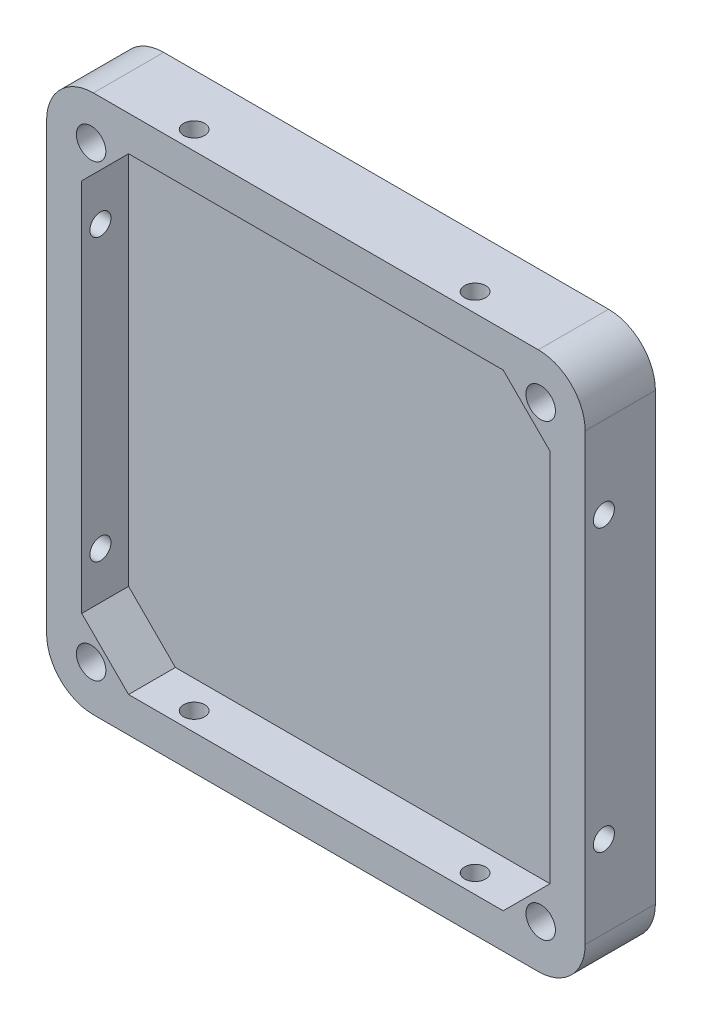
ISO-10303-21;
HEADER;
FILE_DESCRIPTION(('STEP AP214'),'2;1');
FILE_NAME('part.step','',(''),(''),'','','');
FILE_SCHEMA(('AUTOMOTIVE_DESIGN { 1 0 10303 214 1 1 1 1 }'));
ENDSEC;
DATA;
#1=APPLICATION_CONTEXT('core data for automotive mechanical design processes');
#2=APPLICATION_PROTOCOL_DEFINITION('international standard','automotive_design',2000,#1);
#3=PRODUCT_CONTEXT('',#1,'mechanical');
#4=PRODUCT('Part','Part','',(#3));
#5=PRODUCT_RELATED_PRODUCT_CATEGORY('part','',(#4));
#6=PRODUCT_DEFINITION_FORMATION('','',#4);
#7=PRODUCT_DEFINITION_CONTEXT('part definition',#1,'design');
#8=PRODUCT_DEFINITION('design','',#6,#7);
#9=PRODUCT_DEFINITION_SHAPE('','',#8);
#10=(LENGTH_UNIT() NAMED_UNIT(*) SI_UNIT(.MILLI.,.METRE.));
#11=(NAMED_UNIT(*) PLANE_ANGLE_UNIT() SI_UNIT($,.RADIAN.));
#12=(NAMED_UNIT(*) SI_UNIT($,.STERADIAN.) SOLID_ANGLE_UNIT());
#13=UNCERTAINTY_MEASURE_WITH_UNIT(LENGTH_MEASURE(1.E-05),#10,'distance_accuracy_value','');
#14=(GEOMETRIC_REPRESENTATION_CONTEXT(3) GLOBAL_UNCERTAINTY_ASSIGNED_CONTEXT((#13)) GLOBAL_UNIT_ASSIGNED_CONTEXT((#10,
#11,#12)) REPRESENTATION_CONTEXT('',''));
#15=CARTESIAN_POINT('',(0.,0.,0.));
#16=DIRECTION('',(0.,0.,1.));
#17=DIRECTION('',(1.,0.,0.));
#18=AXIS2_PLACEMENT_3D('',#15,#16,#17);
#19=CARTESIAN_POINT('',(-57.5,-57.5,7.5));
#20=DIRECTION('',(1.,0.,0.));
#21=DIRECTION('',(0.,0.,-1.));
#22=AXIS2_PLACEMENT_3D('',#19,#20,#21);
#23=PLANE('',#22);
#24=CARTESIAN_POINT('',(-57.5,-30.,3.5));
#25=DIRECTION('',(1.,0.,0.));
#26=DIRECTION('',(0.,0.,-1.));
#27=AXIS2_PLACEMENT_3D('',#24,#25,#26);
#28=CIRCLE('',#27,2.25);
#29=CARTESIAN_POINT('',(-57.5,-30.,1.25));
#30=VERTEX_POINT('',#29);
#31=EDGE_CURVE('E300',#30,#30,#28,.F.);
#32=ORIENTED_EDGE('',*,*,#31,.F.);
#33=EDGE_LOOP('',(#32));
#34=FACE_BOUND('',#33,.T.);
#35=CARTESIAN_POINT('',(-57.5,30.,3.5));
#36=DIRECTION('',(1.,0.,0.));
#37=DIRECTION('',(0.,0.,-1.));
#38=AXIS2_PLACEMENT_3D('',#35,#36,#37);
#39=CIRCLE('',#38,2.25);
#40=CARTESIAN_POINT('',(-57.5,30.,1.25));
#41=VERTEX_POINT('',#40);
#42=EDGE_CURVE('E307',#41,#41,#39,.T.);
#43=ORIENTED_EDGE('',*,*,#42,.T.);
#44=EDGE_LOOP('',(#43));
#45=FACE_BOUND('',#44,.T.);
#46=DIRECTION('',(0.,-1.,0.));
#47=VECTOR('',#46,1.);
#48=CARTESIAN_POINT('',(-57.5,-57.5,-7.5));
#49=LINE('',#48,#47);
#50=CARTESIAN_POINT('',(-57.5,47.5,-7.5));
#51=VERTEX_POINT('',#50);
#52=CARTESIAN_POINT('',(-57.5,-47.5,-7.5));
#53=VERTEX_POINT('',#52);
#54=EDGE_CURVE('E180',#51,#53,#49,.T.);
#55=ORIENTED_EDGE('',*,*,#54,.T.);
#56=DIRECTION('',(0.,0.,-1.));
#57=VECTOR('',#56,1.);
#58=CARTESIAN_POINT('',(-57.5,-47.5,7.5));
#59=LINE('',#58,#57);
#60=CARTESIAN_POINT('',(-57.5,-47.5,7.5));
#61=VERTEX_POINT('',#60);
#62=EDGE_CURVE('E158',#53,#61,#59,.F.);
#63=ORIENTED_EDGE('',*,*,#62,.T.);
#64=DIRECTION('',(0.,-1.,0.));
#65=VECTOR('',#64,1.);
#66=CARTESIAN_POINT('',(-57.5,-57.5,7.5));
#67=LINE('',#66,#65);
#68=CARTESIAN_POINT('',(-57.5,47.5,7.5));
#69=VERTEX_POINT('',#68);
#70=EDGE_CURVE('E191',#69,#61,#67,.T.);
#71=ORIENTED_EDGE('',*,*,#70,.F.);
#72=DIRECTION('',(0.,0.,-1.));
#73=VECTOR('',#72,1.);
#74=CARTESIAN_POINT('',(-57.5,47.5,7.5));
#75=LINE('',#74,#73);
#76=EDGE_CURVE('E163',#69,#51,#75,.T.);
#77=ORIENTED_EDGE('',*,*,#76,.T.);
#78=EDGE_LOOP('',(#55,#63,#71,#77));
#79=FACE_BOUND('',#78,.T.);
#80=ADVANCED_FACE('F38',(#34,#45,#79),#23,.F.);
#81=CARTESIAN_POINT('',(57.5,-57.5,7.5));
#82=DIRECTION('',(0.,1.,0.));
#83=DIRECTION('',(-1.,0.,0.));
#84=AXIS2_PLACEMENT_3D('',#81,#82,#83);
#85=PLANE('',#84);
#86=CARTESIAN_POINT('',(30.,-57.5,3.5));
#87=DIRECTION('',(0.,-1.,0.));
#88=DIRECTION('',(1.,0.,0.));
#89=AXIS2_PLACEMENT_3D('',#86,#87,#88);
#90=CIRCLE('',#89,2.25);
#91=CARTESIAN_POINT('',(32.25,-57.5,3.5));
#92=VERTEX_POINT('',#91);
#93=EDGE_CURVE('E468',#92,#92,#90,.T.);
#94=ORIENTED_EDGE('',*,*,#93,.F.);
#95=EDGE_LOOP('',(#94));
#96=FACE_BOUND('',#95,.T.);
#97=CARTESIAN_POINT('',(-30.,-57.5,3.5));
#98=DIRECTION('',(0.,1.,0.));
#99=DIRECTION('',(-1.,0.,0.));
#100=AXIS2_PLACEMENT_3D('',#97,#98,#99);
#101=CIRCLE('',#100,2.25);
#102=CARTESIAN_POINT('',(-32.25,-57.5,3.5));
#103=VERTEX_POINT('',#102);
#104=EDGE_CURVE('E280',#103,#103,#101,.T.);
#105=ORIENTED_EDGE('',*,*,#104,.T.);
#106=EDGE_LOOP('',(#105));
#107=FACE_BOUND('',#106,.T.);
#108=DIRECTION('',(1.,0.,0.));
#109=VECTOR('',#108,1.);
#110=CARTESIAN_POINT('',(57.5,-57.5,7.5));
#111=LINE('',#110,#109);
#112=CARTESIAN_POINT('',(-47.5,-57.5,7.5));
#113=VERTEX_POINT('',#112);
#114=CARTESIAN_POINT('',(47.5,-57.5,7.5));
#115=VERTEX_POINT('',#114);
#116=EDGE_CURVE('E173',#113,#115,#111,.T.);
#117=ORIENTED_EDGE('',*,*,#116,.F.);
#118=DIRECTION('',(0.,0.,-1.));
#119=VECTOR('',#118,1.);
#120=CARTESIAN_POINT('',(-47.5,-57.5,7.5));
#121=LINE('',#120,#119);
#122=CARTESIAN_POINT('',(-47.5,-57.5,-7.5));
#123=VERTEX_POINT('',#122);
#124=EDGE_CURVE('E157',#113,#123,#121,.T.);
#125=ORIENTED_EDGE('',*,*,#124,.T.);
#126=DIRECTION('',(1.,0.,0.));
#127=VECTOR('',#126,1.);
#128=CARTESIAN_POINT('',(57.5,-57.5,-7.5));
#129=LINE('',#128,#127);
#130=CARTESIAN_POINT('',(47.5,-57.5,-7.5));
#131=VERTEX_POINT('',#130);
#132=EDGE_CURVE('E170',#123,#131,#129,.T.);
#133=ORIENTED_EDGE('',*,*,#132,.T.);
#134=DIRECTION('',(0.,0.,-1.));
#135=VECTOR('',#134,1.);
#136=CARTESIAN_POINT('',(47.5,-57.5,7.5));
#137=LINE('',#136,#135);
#138=EDGE_CURVE('E175',#131,#115,#137,.F.);
#139=ORIENTED_EDGE('',*,*,#138,.T.);
#140=EDGE_LOOP('',(#117,#125,#133,#139));
#141=FACE_BOUND('',#140,.T.);
#142=ADVANCED_FACE('F169',(#96,#107,#141),#85,.F.);
#143=CARTESIAN_POINT('',(57.5,-57.5,7.5));
#144=DIRECTION('',(-1.,0.,0.));
#145=DIRECTION('',(0.,0.,1.));
#146=AXIS2_PLACEMENT_3D('',#143,#144,#145);
#147=PLANE('',#146);
#148=CARTESIAN_POINT('',(57.5,-30.,3.5));
#149=DIRECTION('',(-1.,0.,0.));
#150=DIRECTION('',(0.,0.,-1.));
#151=AXIS2_PLACEMENT_3D('',#148,#149,#150);
#152=CIRCLE('',#151,2.25);
#153=CARTESIAN_POINT('',(57.5,-30.,1.25));
#154=VERTEX_POINT('',#153);
#155=EDGE_CURVE('E276',#154,#154,#152,.T.);
#156=ORIENTED_EDGE('',*,*,#155,.T.);
#157=EDGE_LOOP('',(#156));
#158=FACE_BOUND('',#157,.T.);
#159=CARTESIAN_POINT('',(57.5,30.,3.5));
#160=DIRECTION('',(1.,0.,0.));
#161=DIRECTION('',(0.,0.,-1.));
#162=AXIS2_PLACEMENT_3D('',#159,#160,#161);
#163=CIRCLE('',#162,2.25);
#164=CARTESIAN_POINT('',(57.5,30.,1.25));
#165=VERTEX_POINT('',#164);
#166=EDGE_CURVE('E272',#165,#165,#163,.T.);
#167=ORIENTED_EDGE('',*,*,#166,.F.);
#168=EDGE_LOOP('',(#167));
#169=FACE_BOUND('',#168,.T.);
#170=DIRECTION('',(0.,1.,0.));
#171=VECTOR('',#170,1.);
#172=CARTESIAN_POINT('',(57.5,-57.5,7.5));
#173=LINE('',#172,#171);
#174=CARTESIAN_POINT('',(57.5,-47.5,7.5));
#175=VERTEX_POINT('',#174);
#176=CARTESIAN_POINT('',(57.5,47.5,7.5));
#177=VERTEX_POINT('',#176);
#178=EDGE_CURVE('E342',#175,#177,#173,.T.);
#179=ORIENTED_EDGE('',*,*,#178,.F.);
#180=DIRECTION('',(0.,0.,-1.));
#181=VECTOR('',#180,1.);
#182=CARTESIAN_POINT('',(57.5,-47.5,7.5));
#183=LINE('',#182,#181);
#184=CARTESIAN_POINT('',(57.5,-47.5,-7.5));
#185=VERTEX_POINT('',#184);
#186=EDGE_CURVE('E211',#175,#185,#183,.T.);
#187=ORIENTED_EDGE('',*,*,#186,.T.);
#188=DIRECTION('',(0.,1.,0.));
#189=VECTOR('',#188,1.);
#190=CARTESIAN_POINT('',(57.5,-57.5,-7.5));
#191=LINE('',#190,#189);
#192=CARTESIAN_POINT('',(57.5,47.5,-7.5));
#193=VERTEX_POINT('',#192);
#194=EDGE_CURVE('E179',#185,#193,#191,.T.);
#195=ORIENTED_EDGE('',*,*,#194,.T.);
#196=DIRECTION('',(0.,0.,-1.));
#197=VECTOR('',#196,1.);
#198=CARTESIAN_POINT('',(57.5,47.5,7.5));
#199=LINE('',#198,#197);
#200=EDGE_CURVE('E209',#193,#177,#199,.F.);
#201=ORIENTED_EDGE('',*,*,#200,.T.);
#202=EDGE_LOOP('',(#179,#187,#195,#201));
#203=FACE_BOUND('',#202,.T.);
#204=ADVANCED_FACE('F365',(#158,#169,#203),#147,.F.);
#205=CARTESIAN_POINT('',(57.5,57.5,7.5));
#206=DIRECTION('',(0.,-1.,0.));
#207=DIRECTION('',(1.,0.,0.));
#208=AXIS2_PLACEMENT_3D('',#205,#206,#207);
#209=PLANE('',#208);
#210=CARTESIAN_POINT('',(30.,57.5,3.5));
#211=DIRECTION('',(0.,-1.,0.));
#212=DIRECTION('',(1.,0.,0.));
#213=AXIS2_PLACEMENT_3D('',#210,#211,#212);
#214=CIRCLE('',#213,2.25);
#215=CARTESIAN_POINT('',(32.25,57.5,3.5));
#216=VERTEX_POINT('',#215);
#217=EDGE_CURVE('E464',#216,#216,#214,.T.);
#218=ORIENTED_EDGE('',*,*,#217,.T.);
#219=EDGE_LOOP('',(#218));
#220=FACE_BOUND('',#219,.T.);
#221=CARTESIAN_POINT('',(-30.,57.5,3.5));
#222=DIRECTION('',(0.,1.,0.));
#223=DIRECTION('',(-1.,0.,0.));
#224=AXIS2_PLACEMENT_3D('',#221,#222,#223);
#225=CIRCLE('',#224,2.25);
#226=CARTESIAN_POINT('',(-32.25,57.5,3.5));
#227=VERTEX_POINT('',#226);
#228=EDGE_CURVE('E286',#227,#227,#225,.T.);
#229=ORIENTED_EDGE('',*,*,#228,.F.);
#230=EDGE_LOOP('',(#229));
#231=FACE_BOUND('',#230,.T.);
#232=DIRECTION('',(-1.,0.,0.));
#233=VECTOR('',#232,1.);
#234=CARTESIAN_POINT('',(57.5,57.5,-7.5));
#235=LINE('',#234,#233);
#236=CARTESIAN_POINT('',(47.5,57.5,-7.5));
#237=VERTEX_POINT('',#236);
#238=CARTESIAN_POINT('',(-47.5,57.5,-7.5));
#239=VERTEX_POINT('',#238);
#240=EDGE_CURVE('E183',#237,#239,#235,.T.);
#241=ORIENTED_EDGE('',*,*,#240,.T.);
#242=DIRECTION('',(0.,0.,-1.));
#243=VECTOR('',#242,1.);
#244=CARTESIAN_POINT('',(-47.5,57.5,7.5));
#245=LINE('',#244,#243);
#246=CARTESIAN_POINT('',(-47.5,57.5,7.5));
#247=VERTEX_POINT('',#246);
#248=EDGE_CURVE('E217',#239,#247,#245,.F.);
#249=ORIENTED_EDGE('',*,*,#248,.T.);
#250=DIRECTION('',(-1.,0.,0.));
#251=VECTOR('',#250,1.);
#252=CARTESIAN_POINT('',(57.5,57.5,7.5));
#253=LINE('',#252,#251);
#254=CARTESIAN_POINT('',(47.5,57.5,7.5));
#255=VERTEX_POINT('',#254);
#256=EDGE_CURVE('E192',#255,#247,#253,.T.);
#257=ORIENTED_EDGE('',*,*,#256,.F.);
#258=DIRECTION('',(0.,0.,-1.));
#259=VECTOR('',#258,1.);
#260=CARTESIAN_POINT('',(47.5,57.5,7.5));
#261=LINE('',#260,#259);
#262=EDGE_CURVE('E214',#255,#237,#261,.T.);
#263=ORIENTED_EDGE('',*,*,#262,.T.);
#264=EDGE_LOOP('',(#241,#249,#257,#263));
#265=FACE_BOUND('',#264,.T.);
#266=ADVANCED_FACE('F359',(#220,#231,#265),#209,.F.);
#267=CARTESIAN_POINT('',(0.,0.,7.5));
#268=DIRECTION('',(0.,0.,1.));
#269=DIRECTION('',(1.,0.,0.));
#270=AXIS2_PLACEMENT_3D('',#267,#268,#269);
#271=PLANE('',#270);
#272=CARTESIAN_POINT('',(48.,-48.,7.5));
#273=DIRECTION('',(0.,0.,1.));
#274=DIRECTION('',(-1.,0.,0.));
#275=AXIS2_PLACEMENT_3D('',#272,#273,#274);
#276=CIRCLE('',#275,3.15);
#277=CARTESIAN_POINT('',(44.85,-48.,7.5));
#278=VERTEX_POINT('',#277);
#279=EDGE_CURVE('E267',#278,#278,#276,.T.);
#280=ORIENTED_EDGE('',*,*,#279,.F.);
#281=EDGE_LOOP('',(#280));
#282=FACE_BOUND('',#281,.T.);
#283=CARTESIAN_POINT('',(48.,48.,7.5));
#284=DIRECTION('',(0.,0.,-1.));
#285=DIRECTION('',(-1.,0.,0.));
#286=AXIS2_PLACEMENT_3D('',#283,#284,#285);
#287=CIRCLE('',#286,3.15);
#288=CARTESIAN_POINT('',(44.85,48.,7.5));
#289=VERTEX_POINT('',#288);
#290=EDGE_CURVE('E263',#289,#289,#287,.T.);
#291=ORIENTED_EDGE('',*,*,#290,.T.);
#292=EDGE_LOOP('',(#291));
#293=FACE_BOUND('',#292,.T.);
#294=CARTESIAN_POINT('',(-48.,-48.,7.5));
#295=DIRECTION('',(0.,0.,-1.));
#296=DIRECTION('',(1.,0.,0.));
#297=AXIS2_PLACEMENT_3D('',#294,#295,#296);
#298=CIRCLE('',#297,3.15);
#299=CARTESIAN_POINT('',(-44.85,-48.,7.5));
#300=VERTEX_POINT('',#299);
#301=EDGE_CURVE('E259',#300,#300,#298,.T.);
#302=ORIENTED_EDGE('',*,*,#301,.T.);
#303=EDGE_LOOP('',(#302));
#304=FACE_BOUND('',#303,.T.);
#305=CARTESIAN_POINT('',(-48.,48.,7.5));
#306=DIRECTION('',(0.,0.,1.));
#307=DIRECTION('',(1.,0.,0.));
#308=AXIS2_PLACEMENT_3D('',#305,#306,#307);
#309=CIRCLE('',#308,3.15);
#310=CARTESIAN_POINT('',(-44.85,48.,7.5));
#311=VERTEX_POINT('',#310);
#312=EDGE_CURVE('E255',#311,#311,#309,.T.);
#313=ORIENTED_EDGE('',*,*,#312,.F.);
#314=EDGE_LOOP('',(#313));
#315=FACE_BOUND('',#314,.T.);
#316=DIRECTION('',(0.,-1.,0.));
#317=VECTOR('',#316,1.);
#318=CARTESIAN_POINT('',(-50.,-50.,7.5));
#319=LINE('',#318,#317);
#320=CARTESIAN_POINT('',(-50.,39.9999999999999,7.5));
#321=VERTEX_POINT('',#320);
#322=CARTESIAN_POINT('',(-50.,-40.,7.5));
#323=VERTEX_POINT('',#322);
#324=EDGE_CURVE('E254',#321,#323,#319,.T.);
#325=ORIENTED_EDGE('',*,*,#324,.F.);
#326=DIRECTION('',(-0.707106781186543,-0.707106781186552,0.));
#327=VECTOR('',#326,1.);
#328=CARTESIAN_POINT('',(-50.,39.9999999999999,7.5));
#329=LINE('',#328,#327);
#330=CARTESIAN_POINT('',(-40.,50.,7.5));
#331=VERTEX_POINT('',#330);
#332=EDGE_CURVE('E11',#321,#331,#329,.F.);
#333=ORIENTED_EDGE('',*,*,#332,.T.);
#334=DIRECTION('',(-1.,0.,0.));
#335=VECTOR('',#334,1.);
#336=CARTESIAN_POINT('',(50.,50.,7.5));
#337=LINE('',#336,#335);
#338=CARTESIAN_POINT('',(39.9999999999999,50.,7.5));
#339=VERTEX_POINT('',#338);
#340=EDGE_CURVE('E322',#339,#331,#337,.T.);
#341=ORIENTED_EDGE('',*,*,#340,.F.);
#342=DIRECTION('',(-0.707106781186551,0.707106781186544,0.));
#343=VECTOR('',#342,1.);
#344=CARTESIAN_POINT('',(39.9999999999999,50.,7.5));
#345=LINE('',#344,#343);
#346=CARTESIAN_POINT('',(50.,40.,7.5));
#347=VERTEX_POINT('',#346);
#348=EDGE_CURVE('E48',#339,#347,#345,.F.);
#349=ORIENTED_EDGE('',*,*,#348,.T.);
#350=DIRECTION('',(0.,1.,0.));
#351=VECTOR('',#350,1.);
#352=CARTESIAN_POINT('',(50.,-50.,7.5));
#353=LINE('',#352,#351);
#354=CARTESIAN_POINT('',(50.,-39.9999999999999,7.5));
#355=VERTEX_POINT('',#354);
#356=EDGE_CURVE('E335',#355,#347,#353,.T.);
#357=ORIENTED_EDGE('',*,*,#356,.F.);
#358=DIRECTION('',(0.707106781186544,0.707106781186551,0.));
#359=VECTOR('',#358,1.);
#360=CARTESIAN_POINT('',(50.,-39.9999999999999,7.5));
#361=LINE('',#360,#359);
#362=CARTESIAN_POINT('',(40.,-50.,7.5));
#363=VERTEX_POINT('',#362);
#364=EDGE_CURVE('E248',#355,#363,#361,.F.);
#365=ORIENTED_EDGE('',*,*,#364,.T.);
#366=DIRECTION('',(1.,0.,0.));
#367=VECTOR('',#366,1.);
#368=CARTESIAN_POINT('',(50.,-50.,7.5));
#369=LINE('',#368,#367);
#370=CARTESIAN_POINT('',(-39.9999999999999,-50.,7.5));
#371=VERTEX_POINT('',#370);
#372=EDGE_CURVE('E332',#371,#363,#369,.T.);
#373=ORIENTED_EDGE('',*,*,#372,.F.);
#374=DIRECTION('',(0.707106781186551,-0.707106781186544,0.));
#375=VECTOR('',#374,1.);
#376=CARTESIAN_POINT('',(-39.9999999999999,-50.,7.5));
#377=LINE('',#376,#375);
#378=EDGE_CURVE('E246',#371,#323,#377,.F.);
#379=ORIENTED_EDGE('',*,*,#378,.T.);
#380=EDGE_LOOP('',(#325,#333,#341,#349,#357,#365,#373,#379));
#381=FACE_BOUND('',#380,.T.);
#382=ORIENTED_EDGE('',*,*,#70,.T.);
#383=CARTESIAN_POINT('',(-47.5,-47.5,7.5));
#384=DIRECTION('',(0.,0.,1.));
#385=DIRECTION('',(1.,0.,0.));
#386=AXIS2_PLACEMENT_3D('',#383,#384,#385);
#387=CIRCLE('',#386,10.);
#388=EDGE_CURVE('E207',#61,#113,#387,.T.);
#389=ORIENTED_EDGE('',*,*,#388,.T.);
#390=ORIENTED_EDGE('',*,*,#116,.T.);
#391=CARTESIAN_POINT('',(47.5,-47.5,7.5));
#392=DIRECTION('',(0.,0.,1.));
#393=DIRECTION('',(1.,0.,0.));
#394=AXIS2_PLACEMENT_3D('',#391,#392,#393);
#395=CIRCLE('',#394,10.);
#396=EDGE_CURVE('E205',#115,#175,#395,.T.);
#397=ORIENTED_EDGE('',*,*,#396,.T.);
#398=ORIENTED_EDGE('',*,*,#178,.T.);
#399=CARTESIAN_POINT('',(47.5,47.5,7.5));
#400=DIRECTION('',(0.,0.,1.));
#401=DIRECTION('',(1.,0.,0.));
#402=AXIS2_PLACEMENT_3D('',#399,#400,#401);
#403=CIRCLE('',#402,10.);
#404=EDGE_CURVE('E201',#177,#255,#403,.T.);
#405=ORIENTED_EDGE('',*,*,#404,.T.);
#406=ORIENTED_EDGE('',*,*,#256,.T.);
#407=CARTESIAN_POINT('',(-47.5,47.5,7.5));
#408=DIRECTION('',(0.,0.,1.));
#409=DIRECTION('',(1.,0.,0.));
#410=AXIS2_PLACEMENT_3D('',#407,#408,#409);
#411=CIRCLE('',#410,10.);
#412=EDGE_CURVE('E203',#247,#69,#411,.T.);
#413=ORIENTED_EDGE('',*,*,#412,.T.);
#414=EDGE_LOOP('',(#382,#389,#390,#397,#398,#405,#406,#413));
#415=FACE_BOUND('',#414,.T.);
#416=ADVANCED_FACE('F348',(#282,#293,#304,#315,#381,#415),#271,.T.);
#417=CARTESIAN_POINT('',(0.,0.,-7.5));
#418=DIRECTION('',(0.,0.,1.));
#419=DIRECTION('',(1.,0.,0.));
#420=AXIS2_PLACEMENT_3D('',#417,#418,#419);
#421=PLANE('',#420);
#422=CARTESIAN_POINT('',(48.,-48.,-7.5));
#423=DIRECTION('',(0.,0.,1.));
#424=DIRECTION('',(1.,0.,0.));
#425=AXIS2_PLACEMENT_3D('',#422,#423,#424);
#426=CIRCLE('',#425,3.15);
#427=CARTESIAN_POINT('',(51.15,-48.,-7.5));
#428=VERTEX_POINT('',#427);
#429=EDGE_CURVE('E264',#428,#428,#426,.T.);
#430=ORIENTED_EDGE('',*,*,#429,.T.);
#431=EDGE_LOOP('',(#430));
#432=FACE_BOUND('',#431,.T.);
#433=CARTESIAN_POINT('',(48.,48.,-7.5));
#434=DIRECTION('',(0.,0.,1.));
#435=DIRECTION('',(1.,0.,0.));
#436=AXIS2_PLACEMENT_3D('',#433,#434,#435);
#437=CIRCLE('',#436,3.15);
#438=CARTESIAN_POINT('',(51.15,48.,-7.5));
#439=VERTEX_POINT('',#438);
#440=EDGE_CURVE('E260',#439,#439,#437,.F.);
#441=ORIENTED_EDGE('',*,*,#440,.F.);
#442=EDGE_LOOP('',(#441));
#443=FACE_BOUND('',#442,.T.);
#444=CARTESIAN_POINT('',(-48.,-48.,-7.5));
#445=DIRECTION('',(0.,0.,1.));
#446=DIRECTION('',(1.,0.,0.));
#447=AXIS2_PLACEMENT_3D('',#444,#445,#446);
#448=CIRCLE('',#447,3.15);
#449=CARTESIAN_POINT('',(-44.85,-48.,-7.5));
#450=VERTEX_POINT('',#449);
#451=EDGE_CURVE('E256',#450,#450,#448,.F.);
#452=ORIENTED_EDGE('',*,*,#451,.F.);
#453=EDGE_LOOP('',(#452));
#454=FACE_BOUND('',#453,.T.);
#455=CARTESIAN_POINT('',(-48.,48.,-7.5));
#456=DIRECTION('',(0.,0.,1.));
#457=DIRECTION('',(1.,0.,0.));
#458=AXIS2_PLACEMENT_3D('',#455,#456,#457);
#459=CIRCLE('',#458,3.15);
#460=CARTESIAN_POINT('',(-44.85,48.,-7.5));
#461=VERTEX_POINT('',#460);
#462=EDGE_CURVE('E251',#461,#461,#459,.T.);
#463=ORIENTED_EDGE('',*,*,#462,.T.);
#464=EDGE_LOOP('',(#463));
#465=FACE_BOUND('',#464,.T.);
#466=ORIENTED_EDGE('',*,*,#132,.F.);
#467=CARTESIAN_POINT('',(-47.5,-47.5,-7.5));
#468=DIRECTION('',(0.,0.,1.));
#469=DIRECTION('',(1.,0.,0.));
#470=AXIS2_PLACEMENT_3D('',#467,#468,#469);
#471=CIRCLE('',#470,10.);
#472=EDGE_CURVE('E153',#123,#53,#471,.F.);
#473=ORIENTED_EDGE('',*,*,#472,.T.);
#474=ORIENTED_EDGE('',*,*,#54,.F.);
#475=CARTESIAN_POINT('',(-47.5,47.5,-7.5));
#476=DIRECTION('',(0.,0.,1.));
#477=DIRECTION('',(1.,0.,0.));
#478=AXIS2_PLACEMENT_3D('',#475,#476,#477);
#479=CIRCLE('',#478,10.);
#480=EDGE_CURVE('E195',#51,#239,#479,.F.);
#481=ORIENTED_EDGE('',*,*,#480,.T.);
#482=ORIENTED_EDGE('',*,*,#240,.F.);
#483=CARTESIAN_POINT('',(47.5,47.5,-7.5));
#484=DIRECTION('',(0.,0.,1.));
#485=DIRECTION('',(1.,0.,0.));
#486=AXIS2_PLACEMENT_3D('',#483,#484,#485);
#487=CIRCLE('',#486,10.);
#488=EDGE_CURVE('E174',#237,#193,#487,.F.);
#489=ORIENTED_EDGE('',*,*,#488,.T.);
#490=ORIENTED_EDGE('',*,*,#194,.F.);
#491=CARTESIAN_POINT('',(47.5,-47.5,-7.5));
#492=DIRECTION('',(0.,0.,1.));
#493=DIRECTION('',(1.,0.,0.));
#494=AXIS2_PLACEMENT_3D('',#491,#492,#493);
#495=CIRCLE('',#494,10.);
#496=EDGE_CURVE('E164',#185,#131,#495,.F.);
#497=ORIENTED_EDGE('',*,*,#496,.T.);
#498=EDGE_LOOP('',(#466,#473,#474,#481,#482,#489,#490,#497));
#499=FACE_BOUND('',#498,.T.);
#500=ADVANCED_FACE('F177',(#432,#443,#454,#465,#499),#421,.F.);
#501=CARTESIAN_POINT('',(-47.5,-47.5,7.5));
#502=DIRECTION('',(0.,0.,-1.));
#503=DIRECTION('',(-1.,0.,0.));
#504=AXIS2_PLACEMENT_3D('',#501,#502,#503);
#505=CYLINDRICAL_SURFACE('',#504,10.);
#506=ORIENTED_EDGE('',*,*,#388,.F.);
#507=ORIENTED_EDGE('',*,*,#62,.F.);
#508=ORIENTED_EDGE('',*,*,#472,.F.);
#509=ORIENTED_EDGE('',*,*,#124,.F.);
#510=EDGE_LOOP('',(#506,#507,#508,#509));
#511=FACE_BOUND('',#510,.T.);
#512=ADVANCED_FACE('F156',(#511),#505,.T.);
#513=CARTESIAN_POINT('',(47.5,-47.5,7.5));
#514=DIRECTION('',(0.,0.,-1.));
#515=DIRECTION('',(-1.,0.,0.));
#516=AXIS2_PLACEMENT_3D('',#513,#514,#515);
#517=CYLINDRICAL_SURFACE('',#516,10.);
#518=ORIENTED_EDGE('',*,*,#396,.F.);
#519=ORIENTED_EDGE('',*,*,#138,.F.);
#520=ORIENTED_EDGE('',*,*,#496,.F.);
#521=ORIENTED_EDGE('',*,*,#186,.F.);
#522=EDGE_LOOP('',(#518,#519,#520,#521));
#523=FACE_BOUND('',#522,.T.);
#524=ADVANCED_FACE('F369',(#523),#517,.T.);
#525=CARTESIAN_POINT('',(-47.5,47.5,7.5));
#526=DIRECTION('',(0.,0.,-1.));
#527=DIRECTION('',(-1.,0.,0.));
#528=AXIS2_PLACEMENT_3D('',#525,#526,#527);
#529=CYLINDRICAL_SURFACE('',#528,10.);
#530=ORIENTED_EDGE('',*,*,#412,.F.);
#531=ORIENTED_EDGE('',*,*,#248,.F.);
#532=ORIENTED_EDGE('',*,*,#480,.F.);
#533=ORIENTED_EDGE('',*,*,#76,.F.);
#534=EDGE_LOOP('',(#530,#531,#532,#533));
#535=FACE_BOUND('',#534,.T.);
#536=ADVANCED_FACE('F356',(#535),#529,.T.);
#537=CARTESIAN_POINT('',(47.5,47.5,7.5));
#538=DIRECTION('',(0.,0.,-1.));
#539=DIRECTION('',(-1.,0.,0.));
#540=AXIS2_PLACEMENT_3D('',#537,#538,#539);
#541=CYLINDRICAL_SURFACE('',#540,10.);
#542=ORIENTED_EDGE('',*,*,#404,.F.);
#543=ORIENTED_EDGE('',*,*,#200,.F.);
#544=ORIENTED_EDGE('',*,*,#488,.F.);
#545=ORIENTED_EDGE('',*,*,#262,.F.);
#546=EDGE_LOOP('',(#542,#543,#544,#545));
#547=FACE_BOUND('',#546,.T.);
#548=ADVANCED_FACE('F361',(#547),#541,.T.);
#549=CARTESIAN_POINT('',(-50.,-50.,-2.5));
#550=DIRECTION('',(-1.,0.,0.));
#551=DIRECTION('',(0.,0.,1.));
#552=AXIS2_PLACEMENT_3D('',#549,#550,#551);
#553=PLANE('',#552);
#554=CARTESIAN_POINT('',(-50.,-30.,3.5));
#555=DIRECTION('',(-1.,0.,0.));
#556=DIRECTION('',(0.,0.,1.));
#557=AXIS2_PLACEMENT_3D('',#554,#555,#556);
#558=CIRCLE('',#557,2.25);
#559=CARTESIAN_POINT('',(-50.,-30.,5.75));
#560=VERTEX_POINT('',#559);
#561=EDGE_CURVE('E275',#560,#560,#558,.F.);
#562=ORIENTED_EDGE('',*,*,#561,.F.);
#563=EDGE_LOOP('',(#562));
#564=FACE_BOUND('',#563,.T.);
#565=CARTESIAN_POINT('',(-50.,30.,3.5));
#566=DIRECTION('',(-1.,0.,0.));
#567=DIRECTION('',(0.,0.,1.));
#568=AXIS2_PLACEMENT_3D('',#565,#566,#567);
#569=CIRCLE('',#568,2.25);
#570=CARTESIAN_POINT('',(-50.,30.,5.75));
#571=VERTEX_POINT('',#570);
#572=EDGE_CURVE('E271',#571,#571,#569,.T.);
#573=ORIENTED_EDGE('',*,*,#572,.T.);
#574=EDGE_LOOP('',(#573));
#575=FACE_BOUND('',#574,.T.);
#576=ORIENTED_EDGE('',*,*,#324,.T.);
#577=DIRECTION('',(0.,0.,-1.));
#578=VECTOR('',#577,1.);
#579=CARTESIAN_POINT('',(-50.,-40.,-2.5));
#580=LINE('',#579,#578);
#581=CARTESIAN_POINT('',(-50.,-40.,-2.5));
#582=VERTEX_POINT('',#581);
#583=EDGE_CURVE('E227',#323,#582,#580,.T.);
#584=ORIENTED_EDGE('',*,*,#583,.T.);
#585=DIRECTION('',(0.,-1.,0.));
#586=VECTOR('',#585,1.);
#587=CARTESIAN_POINT('',(-50.,-50.,-2.5));
#588=LINE('',#587,#586);
#589=CARTESIAN_POINT('',(-50.,39.9999999999999,-2.5));
#590=VERTEX_POINT('',#589);
#591=EDGE_CURVE('E318',#590,#582,#588,.T.);
#592=ORIENTED_EDGE('',*,*,#591,.F.);
#593=DIRECTION('',(0.,0.,1.));
#594=VECTOR('',#593,1.);
#595=CARTESIAN_POINT('',(-50.,39.9999999999999,7.5));
#596=LINE('',#595,#594);
#597=EDGE_CURVE('E224',#590,#321,#596,.T.);
#598=ORIENTED_EDGE('',*,*,#597,.T.);
#599=EDGE_LOOP('',(#576,#584,#592,#598));
#600=FACE_BOUND('',#599,.T.);
#601=ADVANCED_FACE('F401',(#564,#575,#600),#553,.F.);
#602=CARTESIAN_POINT('',(50.,50.,-2.5));
#603=DIRECTION('',(0.,1.,0.));
#604=DIRECTION('',(-1.,0.,0.));
#605=AXIS2_PLACEMENT_3D('',#602,#603,#604);
#606=PLANE('',#605);
#607=CARTESIAN_POINT('',(30.,50.,3.5));
#608=DIRECTION('',(0.,1.,0.));
#609=DIRECTION('',(-1.,0.,0.));
#610=AXIS2_PLACEMENT_3D('',#607,#608,#609);
#611=CIRCLE('',#610,2.25);
#612=CARTESIAN_POINT('',(27.75,50.,3.5));
#613=VERTEX_POINT('',#612);
#614=EDGE_CURVE('E291',#613,#613,#611,.F.);
#615=ORIENTED_EDGE('',*,*,#614,.F.);
#616=EDGE_LOOP('',(#615));
#617=FACE_BOUND('',#616,.T.);
#618=CARTESIAN_POINT('',(-30.,50.,3.5));
#619=DIRECTION('',(0.,1.,0.));
#620=DIRECTION('',(-1.,0.,0.));
#621=AXIS2_PLACEMENT_3D('',#618,#619,#620);
#622=CIRCLE('',#621,2.25);
#623=CARTESIAN_POINT('',(-32.25,50.,3.5));
#624=VERTEX_POINT('',#623);
#625=EDGE_CURVE('E279',#624,#624,#622,.T.);
#626=ORIENTED_EDGE('',*,*,#625,.T.);
#627=EDGE_LOOP('',(#626));
#628=FACE_BOUND('',#627,.T.);
#629=DIRECTION('',(-1.,0.,0.));
#630=VECTOR('',#629,1.);
#631=CARTESIAN_POINT('',(50.,50.,-2.5));
#632=LINE('',#631,#630);
#633=CARTESIAN_POINT('',(39.9999999999999,50.,-2.5));
#634=VERTEX_POINT('',#633);
#635=CARTESIAN_POINT('',(-40.,50.,-2.5));
#636=VERTEX_POINT('',#635);
#637=EDGE_CURVE('E185',#634,#636,#632,.T.);
#638=ORIENTED_EDGE('',*,*,#637,.F.);
#639=DIRECTION('',(0.,0.,1.));
#640=VECTOR('',#639,1.);
#641=CARTESIAN_POINT('',(39.9999999999999,50.,7.5));
#642=LINE('',#641,#640);
#643=EDGE_CURVE('E244',#634,#339,#642,.T.);
#644=ORIENTED_EDGE('',*,*,#643,.T.);
#645=ORIENTED_EDGE('',*,*,#340,.T.);
#646=DIRECTION('',(0.,0.,-1.));
#647=VECTOR('',#646,1.);
#648=CARTESIAN_POINT('',(-40.,50.,-2.5));
#649=LINE('',#648,#647);
#650=EDGE_CURVE('E242',#331,#636,#649,.T.);
#651=ORIENTED_EDGE('',*,*,#650,.T.);
#652=EDGE_LOOP('',(#638,#644,#645,#651));
#653=FACE_BOUND('',#652,.T.);
#654=ADVANCED_FACE('F404',(#617,#628,#653),#606,.F.);
#655=CARTESIAN_POINT('',(50.,-50.,-2.5));
#656=DIRECTION('',(1.,0.,0.));
#657=DIRECTION('',(0.,0.,-1.));
#658=AXIS2_PLACEMENT_3D('',#655,#656,#657);
#659=PLANE('',#658);
#660=CARTESIAN_POINT('',(50.,-30.,3.5));
#661=DIRECTION('',(1.,0.,0.));
#662=DIRECTION('',(0.,0.,-1.));
#663=AXIS2_PLACEMENT_3D('',#660,#661,#662);
#664=CIRCLE('',#663,2.25);
#665=CARTESIAN_POINT('',(50.,-30.,1.25));
#666=VERTEX_POINT('',#665);
#667=EDGE_CURVE('E273',#666,#666,#664,.F.);
#668=ORIENTED_EDGE('',*,*,#667,.F.);
#669=EDGE_LOOP('',(#668));
#670=FACE_BOUND('',#669,.T.);
#671=CARTESIAN_POINT('',(50.,30.,3.5));
#672=DIRECTION('',(1.,0.,0.));
#673=DIRECTION('',(0.,0.,-1.));
#674=AXIS2_PLACEMENT_3D('',#671,#672,#673);
#675=CIRCLE('',#674,2.25);
#676=CARTESIAN_POINT('',(50.,30.,1.25));
#677=VERTEX_POINT('',#676);
#678=EDGE_CURVE('E268',#677,#677,#675,.T.);
#679=ORIENTED_EDGE('',*,*,#678,.T.);
#680=EDGE_LOOP('',(#679));
#681=FACE_BOUND('',#680,.T.);
#682=DIRECTION('',(0.,1.,0.));
#683=VECTOR('',#682,1.);
#684=CARTESIAN_POINT('',(50.,-50.,-2.5));
#685=LINE('',#684,#683);
#686=CARTESIAN_POINT('',(50.,-39.9999999999999,-2.5));
#687=VERTEX_POINT('',#686);
#688=CARTESIAN_POINT('',(50.,40.,-2.5));
#689=VERTEX_POINT('',#688);
#690=EDGE_CURVE('E325',#687,#689,#685,.T.);
#691=ORIENTED_EDGE('',*,*,#690,.F.);
#692=DIRECTION('',(0.,0.,1.));
#693=VECTOR('',#692,1.);
#694=CARTESIAN_POINT('',(50.,-39.9999999999999,7.5));
#695=LINE('',#694,#693);
#696=EDGE_CURVE('E239',#687,#355,#695,.T.);
#697=ORIENTED_EDGE('',*,*,#696,.T.);
#698=ORIENTED_EDGE('',*,*,#356,.T.);
#699=DIRECTION('',(0.,0.,-1.));
#700=VECTOR('',#699,1.);
#701=CARTESIAN_POINT('',(50.,40.,-2.5));
#702=LINE('',#701,#700);
#703=EDGE_CURVE('E237',#347,#689,#702,.T.);
#704=ORIENTED_EDGE('',*,*,#703,.T.);
#705=EDGE_LOOP('',(#691,#697,#698,#704));
#706=FACE_BOUND('',#705,.T.);
#707=ADVANCED_FACE('F410',(#670,#681,#706),#659,.F.);
#708=CARTESIAN_POINT('',(50.,-50.,-2.5));
#709=DIRECTION('',(0.,-1.,0.));
#710=DIRECTION('',(1.,0.,0.));
#711=AXIS2_PLACEMENT_3D('',#708,#709,#710);
#712=PLANE('',#711);
#713=CARTESIAN_POINT('',(30.,-50.,3.5));
#714=DIRECTION('',(0.,-1.,0.));
#715=DIRECTION('',(1.,0.,0.));
#716=AXIS2_PLACEMENT_3D('',#713,#714,#715);
#717=CIRCLE('',#716,2.25);
#718=CARTESIAN_POINT('',(32.25,-50.,3.5));
#719=VERTEX_POINT('',#718);
#720=EDGE_CURVE('E43',#719,#719,#717,.F.);
#721=ORIENTED_EDGE('',*,*,#720,.F.);
#722=EDGE_LOOP('',(#721));
#723=FACE_BOUND('',#722,.T.);
#724=CARTESIAN_POINT('',(-30.,-50.,3.5));
#725=DIRECTION('',(0.,-1.,0.));
#726=DIRECTION('',(1.,0.,0.));
#727=AXIS2_PLACEMENT_3D('',#724,#725,#726);
#728=CIRCLE('',#727,2.25);
#729=CARTESIAN_POINT('',(-32.25,-50.,3.5));
#730=VERTEX_POINT('',#729);
#731=EDGE_CURVE('E277',#730,#730,#728,.T.);
#732=ORIENTED_EDGE('',*,*,#731,.T.);
#733=EDGE_LOOP('',(#732));
#734=FACE_BOUND('',#733,.T.);
#735=DIRECTION('',(1.,0.,0.));
#736=VECTOR('',#735,1.);
#737=CARTESIAN_POINT('',(50.,-50.,-2.5));
#738=LINE('',#737,#736);
#739=CARTESIAN_POINT('',(-39.9999999999999,-50.,-2.5));
#740=VERTEX_POINT('',#739);
#741=CARTESIAN_POINT('',(40.,-50.,-2.5));
#742=VERTEX_POINT('',#741);
#743=EDGE_CURVE('E321',#740,#742,#738,.T.);
#744=ORIENTED_EDGE('',*,*,#743,.F.);
#745=DIRECTION('',(0.,0.,1.));
#746=VECTOR('',#745,1.);
#747=CARTESIAN_POINT('',(-39.9999999999999,-50.,7.5));
#748=LINE('',#747,#746);
#749=EDGE_CURVE('E221',#740,#371,#748,.T.);
#750=ORIENTED_EDGE('',*,*,#749,.T.);
#751=ORIENTED_EDGE('',*,*,#372,.T.);
#752=DIRECTION('',(0.,0.,-1.));
#753=VECTOR('',#752,1.);
#754=CARTESIAN_POINT('',(40.,-50.,-2.5));
#755=LINE('',#754,#753);
#756=EDGE_CURVE('E219',#363,#742,#755,.T.);
#757=ORIENTED_EDGE('',*,*,#756,.T.);
#758=EDGE_LOOP('',(#744,#750,#751,#757));
#759=FACE_BOUND('',#758,.T.);
#760=ADVANCED_FACE('F406',(#723,#734,#759),#712,.F.);
#761=CARTESIAN_POINT('',(0.,0.,-2.5));
#762=DIRECTION('',(0.,0.,1.));
#763=DIRECTION('',(1.,0.,0.));
#764=AXIS2_PLACEMENT_3D('',#761,#762,#763);
#765=PLANE('',#764);
#766=ORIENTED_EDGE('',*,*,#591,.T.);
#767=DIRECTION('',(-0.707106781186551,0.707106781186544,0.));
#768=VECTOR('',#767,1.);
#769=CARTESIAN_POINT('',(-44.9999999999998,-45.0000000000002,-2.5));
#770=LINE('',#769,#768);
#771=EDGE_CURVE('E235',#582,#740,#770,.F.);
#772=ORIENTED_EDGE('',*,*,#771,.T.);
#773=ORIENTED_EDGE('',*,*,#743,.T.);
#774=DIRECTION('',(-0.707106781186544,-0.707106781186551,0.));
#775=VECTOR('',#774,1.);
#776=CARTESIAN_POINT('',(45.0000000000002,-44.9999999999997,-2.5));
#777=LINE('',#776,#775);
#778=EDGE_CURVE('E233',#742,#687,#777,.F.);
#779=ORIENTED_EDGE('',*,*,#778,.T.);
#780=ORIENTED_EDGE('',*,*,#690,.T.);
#781=DIRECTION('',(0.707106781186551,-0.707106781186544,0.));
#782=VECTOR('',#781,1.);
#783=CARTESIAN_POINT('',(44.9999999999997,45.0000000000002,-2.5));
#784=LINE('',#783,#782);
#785=EDGE_CURVE('E231',#689,#634,#784,.F.);
#786=ORIENTED_EDGE('',*,*,#785,.T.);
#787=ORIENTED_EDGE('',*,*,#637,.T.);
#788=DIRECTION('',(0.707106781186543,0.707106781186552,0.));
#789=VECTOR('',#788,1.);
#790=CARTESIAN_POINT('',(-45.0000000000002,44.9999999999997,-2.5));
#791=LINE('',#790,#789);
#792=EDGE_CURVE('E229',#636,#590,#791,.F.);
#793=ORIENTED_EDGE('',*,*,#792,.T.);
#794=EDGE_LOOP('',(#766,#772,#773,#779,#780,#786,#787,#793));
#795=FACE_BOUND('',#794,.T.);
#796=ADVANCED_FACE('F409',(#795),#765,.T.);
#797=CARTESIAN_POINT('',(-39.9999999999999,-50.,-2.5));
#798=DIRECTION('',(0.707106781186543,0.707106781186551,0.));
#799=DIRECTION('',(0.,0.,-1.));
#800=AXIS2_PLACEMENT_3D('',#797,#798,#799);
#801=PLANE('',#800);
#802=ORIENTED_EDGE('',*,*,#771,.F.);
#803=ORIENTED_EDGE('',*,*,#583,.F.);
#804=ORIENTED_EDGE('',*,*,#378,.F.);
#805=ORIENTED_EDGE('',*,*,#749,.F.);
#806=EDGE_LOOP('',(#802,#803,#804,#805));
#807=FACE_BOUND('',#806,.T.);
#808=ADVANCED_FACE('F420',(#807),#801,.T.);
#809=CARTESIAN_POINT('',(50.,-39.9999999999999,-2.5));
#810=DIRECTION('',(-0.707106781186552,0.707106781186544,0.));
#811=DIRECTION('',(0.,0.,-1.));
#812=AXIS2_PLACEMENT_3D('',#809,#810,#811);
#813=PLANE('',#812);
#814=ORIENTED_EDGE('',*,*,#778,.F.);
#815=ORIENTED_EDGE('',*,*,#756,.F.);
#816=ORIENTED_EDGE('',*,*,#364,.F.);
#817=ORIENTED_EDGE('',*,*,#696,.F.);
#818=EDGE_LOOP('',(#814,#815,#816,#817));
#819=FACE_BOUND('',#818,.T.);
#820=ADVANCED_FACE('F491',(#819),#813,.T.);
#821=CARTESIAN_POINT('',(39.9999999999999,50.,-2.5));
#822=DIRECTION('',(-0.707106781186543,-0.707106781186551,0.));
#823=DIRECTION('',(0.,0.,-1.));
#824=AXIS2_PLACEMENT_3D('',#821,#822,#823);
#825=PLANE('',#824);
#826=ORIENTED_EDGE('',*,*,#785,.F.);
#827=ORIENTED_EDGE('',*,*,#703,.F.);
#828=ORIENTED_EDGE('',*,*,#348,.F.);
#829=ORIENTED_EDGE('',*,*,#643,.F.);
#830=EDGE_LOOP('',(#826,#827,#828,#829));
#831=FACE_BOUND('',#830,.T.);
#832=ADVANCED_FACE('F484',(#831),#825,.T.);
#833=CARTESIAN_POINT('',(-50.,39.9999999999999,-2.5));
#834=DIRECTION('',(0.707106781186552,-0.707106781186543,0.));
#835=DIRECTION('',(0.,0.,-1.));
#836=AXIS2_PLACEMENT_3D('',#833,#834,#835);
#837=PLANE('',#836);
#838=ORIENTED_EDGE('',*,*,#792,.F.);
#839=ORIENTED_EDGE('',*,*,#650,.F.);
#840=ORIENTED_EDGE('',*,*,#332,.F.);
#841=ORIENTED_EDGE('',*,*,#597,.F.);
#842=EDGE_LOOP('',(#838,#839,#840,#841));
#843=FACE_BOUND('',#842,.T.);
#844=ADVANCED_FACE('F41',(#843),#837,.T.);
#845=CARTESIAN_POINT('',(-48.,48.,-22.5));
#846=DIRECTION('',(0.,0.,1.));
#847=DIRECTION('',(1.,0.,0.));
#848=AXIS2_PLACEMENT_3D('',#845,#846,#847);
#849=CYLINDRICAL_SURFACE('',#848,3.15);
#850=ORIENTED_EDGE('',*,*,#312,.T.);
#851=EDGE_LOOP('',(#850));
#852=FACE_BOUND('',#851,.T.);
#853=ORIENTED_EDGE('',*,*,#462,.F.);
#854=EDGE_LOOP('',(#853));
#855=FACE_BOUND('',#854,.T.);
#856=ADVANCED_FACE('F422',(#852,#855),#849,.F.);
#857=CARTESIAN_POINT('',(-48.,-48.,-22.5));
#858=DIRECTION('',(0.,0.,1.));
#859=DIRECTION('',(1.,0.,0.));
#860=AXIS2_PLACEMENT_3D('',#857,#858,#859);
#861=CYLINDRICAL_SURFACE('',#860,3.15);
#862=ORIENTED_EDGE('',*,*,#301,.F.);
#863=EDGE_LOOP('',(#862));
#864=FACE_BOUND('',#863,.T.);
#865=ORIENTED_EDGE('',*,*,#451,.T.);
#866=EDGE_LOOP('',(#865));
#867=FACE_BOUND('',#866,.T.);
#868=ADVANCED_FACE('F425',(#864,#867),#861,.F.);
#869=CARTESIAN_POINT('',(48.,48.,-22.5));
#870=DIRECTION('',(0.,0.,1.));
#871=DIRECTION('',(1.,0.,0.));
#872=AXIS2_PLACEMENT_3D('',#869,#870,#871);
#873=CYLINDRICAL_SURFACE('',#872,3.15);
#874=ORIENTED_EDGE('',*,*,#290,.F.);
#875=EDGE_LOOP('',(#874));
#876=FACE_BOUND('',#875,.T.);
#877=ORIENTED_EDGE('',*,*,#440,.T.);
#878=EDGE_LOOP('',(#877));
#879=FACE_BOUND('',#878,.T.);
#880=ADVANCED_FACE('F429',(#876,#879),#873,.F.);
#881=CARTESIAN_POINT('',(48.,-48.,-22.5));
#882=DIRECTION('',(0.,0.,1.));
#883=DIRECTION('',(1.,0.,0.));
#884=AXIS2_PLACEMENT_3D('',#881,#882,#883);
#885=CYLINDRICAL_SURFACE('',#884,3.15);
#886=ORIENTED_EDGE('',*,*,#279,.T.);
#887=EDGE_LOOP('',(#886));
#888=FACE_BOUND('',#887,.T.);
#889=ORIENTED_EDGE('',*,*,#429,.F.);
#890=EDGE_LOOP('',(#889));
#891=FACE_BOUND('',#890,.T.);
#892=ADVANCED_FACE('F433',(#888,#891),#885,.F.);
#893=CARTESIAN_POINT('',(-72.5,30.,3.5));
#894=DIRECTION('',(1.,0.,0.));
#895=DIRECTION('',(0.,0.,-1.));
#896=AXIS2_PLACEMENT_3D('',#893,#894,#895);
#897=CYLINDRICAL_SURFACE('',#896,2.25);
#898=ORIENTED_EDGE('',*,*,#166,.T.);
#899=EDGE_LOOP('',(#898));
#900=FACE_BOUND('',#899,.T.);
#901=ORIENTED_EDGE('',*,*,#678,.F.);
#902=EDGE_LOOP('',(#901));
#903=FACE_BOUND('',#902,.T.);
#904=ADVANCED_FACE('F437',(#900,#903),#897,.F.);
#905=ORIENTED_EDGE('',*,*,#572,.F.);
#906=EDGE_LOOP('',(#905));
#907=FACE_BOUND('',#906,.T.);
#908=ORIENTED_EDGE('',*,*,#42,.F.);
#909=EDGE_LOOP('',(#908));
#910=FACE_BOUND('',#909,.T.);
#911=ADVANCED_FACE('F439',(#907,#910),#897,.F.);
#912=CARTESIAN_POINT('',(-72.5,-30.,3.5));
#913=DIRECTION('',(1.,0.,0.));
#914=DIRECTION('',(0.,0.,-1.));
#915=AXIS2_PLACEMENT_3D('',#912,#913,#914);
#916=CYLINDRICAL_SURFACE('',#915,2.25);
#917=ORIENTED_EDGE('',*,*,#155,.F.);
#918=EDGE_LOOP('',(#917));
#919=FACE_BOUND('',#918,.T.);
#920=ORIENTED_EDGE('',*,*,#667,.T.);
#921=EDGE_LOOP('',(#920));
#922=FACE_BOUND('',#921,.T.);
#923=ADVANCED_FACE('F442',(#919,#922),#916,.F.);
#924=ORIENTED_EDGE('',*,*,#561,.T.);
#925=EDGE_LOOP('',(#924));
#926=FACE_BOUND('',#925,.T.);
#927=ORIENTED_EDGE('',*,*,#31,.T.);
#928=EDGE_LOOP('',(#927));
#929=FACE_BOUND('',#928,.T.);
#930=ADVANCED_FACE('F444',(#926,#929),#916,.F.);
#931=CARTESIAN_POINT('',(-30.,-57.5,3.5));
#932=DIRECTION('',(0.,1.,0.));
#933=DIRECTION('',(-1.,0.,0.));
#934=AXIS2_PLACEMENT_3D('',#931,#932,#933);
#935=CYLINDRICAL_SURFACE('',#934,2.25);
#936=CARTESIAN_POINT('',(-32.25,-57.5,3.5));
#937=CARTESIAN_POINT('',(-32.25,-57.421875,3.5));
#938=CARTESIAN_POINT('',(-32.25,-57.34375,3.5));
#939=CARTESIAN_POINT('',(-32.25,-57.1875,3.5));
#940=CARTESIAN_POINT('',(-32.25,-57.109375,3.5));
#941=CARTESIAN_POINT('',(-32.25,-56.953125,3.5));
#942=CARTESIAN_POINT('',(-32.25,-56.875,3.5));
#943=CARTESIAN_POINT('',(-32.25,-56.71875,3.5));
#944=CARTESIAN_POINT('',(-32.25,-56.640625,3.5));
#945=CARTESIAN_POINT('',(-32.25,-56.484375,3.5));
#946=CARTESIAN_POINT('',(-32.25,-56.40625,3.5));
#947=CARTESIAN_POINT('',(-32.25,-56.25,3.5));
#948=CARTESIAN_POINT('',(-32.25,-56.171875,3.5));
#949=CARTESIAN_POINT('',(-32.25,-56.015625,3.5));
#950=CARTESIAN_POINT('',(-32.25,-55.9375,3.5));
#951=CARTESIAN_POINT('',(-32.25,-55.78125,3.5));
#952=CARTESIAN_POINT('',(-32.25,-55.703125,3.5));
#953=CARTESIAN_POINT('',(-32.25,-55.546875,3.5));
#954=CARTESIAN_POINT('',(-32.25,-55.46875,3.5));
#955=CARTESIAN_POINT('',(-32.25,-55.3125,3.5));
#956=CARTESIAN_POINT('',(-32.25,-55.234375,3.5));
#957=CARTESIAN_POINT('',(-32.25,-55.078125,3.5));
#958=CARTESIAN_POINT('',(-32.25,-55.,3.5));
#959=CARTESIAN_POINT('',(-32.25,-54.84375,3.5));
#960=CARTESIAN_POINT('',(-32.25,-54.765625,3.5));
#961=CARTESIAN_POINT('',(-32.25,-54.609375,3.5));
#962=CARTESIAN_POINT('',(-32.25,-54.53125,3.5));
#963=CARTESIAN_POINT('',(-32.25,-54.375,3.5));
#964=CARTESIAN_POINT('',(-32.25,-54.296875,3.5));
#965=CARTESIAN_POINT('',(-32.25,-54.140625,3.5));
#966=CARTESIAN_POINT('',(-32.25,-54.0625,3.5));
#967=CARTESIAN_POINT('',(-32.25,-53.90625,3.5));
#968=CARTESIAN_POINT('',(-32.25,-53.828125,3.5));
#969=CARTESIAN_POINT('',(-32.25,-53.671875,3.5));
#970=CARTESIAN_POINT('',(-32.25,-53.59375,3.5));
#971=CARTESIAN_POINT('',(-32.25,-53.4375,3.5));
#972=CARTESIAN_POINT('',(-32.25,-53.359375,3.5));
#973=CARTESIAN_POINT('',(-32.25,-53.203125,3.5));
#974=CARTESIAN_POINT('',(-32.25,-53.125,3.5));
#975=CARTESIAN_POINT('',(-32.25,-52.96875,3.5));
#976=CARTESIAN_POINT('',(-32.25,-52.890625,3.5));
#977=CARTESIAN_POINT('',(-32.25,-52.734375,3.5));
#978=CARTESIAN_POINT('',(-32.25,-52.65625,3.5));
#979=CARTESIAN_POINT('',(-32.25,-52.5,3.5));
#980=CARTESIAN_POINT('',(-32.25,-52.421875,3.5));
#981=CARTESIAN_POINT('',(-32.25,-52.265625,3.5));
#982=CARTESIAN_POINT('',(-32.25,-52.1875,3.5));
#983=CARTESIAN_POINT('',(-32.25,-52.03125,3.5));
#984=CARTESIAN_POINT('',(-32.25,-51.953125,3.5));
#985=CARTESIAN_POINT('',(-32.25,-51.796875,3.5));
#986=CARTESIAN_POINT('',(-32.25,-51.71875,3.5));
#987=CARTESIAN_POINT('',(-32.25,-51.5625,3.5));
#988=CARTESIAN_POINT('',(-32.25,-51.484375,3.5));
#989=CARTESIAN_POINT('',(-32.25,-51.328125,3.5));
#990=CARTESIAN_POINT('',(-32.25,-51.25,3.5));
#991=CARTESIAN_POINT('',(-32.25,-51.09375,3.5));
#992=CARTESIAN_POINT('',(-32.25,-51.015625,3.5));
#993=CARTESIAN_POINT('',(-32.25,-50.859375,3.5));
#994=CARTESIAN_POINT('',(-32.25,-50.78125,3.5));
#995=CARTESIAN_POINT('',(-32.25,-50.625,3.5));
#996=CARTESIAN_POINT('',(-32.25,-50.546875,3.5));
#997=CARTESIAN_POINT('',(-32.25,-50.390625,3.5));
#998=CARTESIAN_POINT('',(-32.25,-50.3125,3.5));
#999=CARTESIAN_POINT('',(-32.25,-50.15625,3.5));
#1000=CARTESIAN_POINT('',(-32.25,-50.078125,3.5));
#1001=CARTESIAN_POINT('',(-32.25,-50.,3.5));
#1002=B_SPLINE_CURVE_WITH_KNOTS('',3,(#936,#937,#938,#939,#940,#941,#942,#943,#944,#945,#946,
#947,#948,#949,#950,#951,#952,#953,#954,#955,#956,#957,#958,#959,#960,#961,#962,#963,#964,#965,
#966,#967,#968,#969,#970,#971,#972,#973,#974,#975,#976,#977,#978,#979,#980,#981,#982,#983,#984,
#985,#986,#987,#988,#989,#990,#991,#992,#993,#994,#995,#996,#997,#998,#999,#1000,#1001),
.UNSPECIFIED.,.F.,.F.,(4,2,2,2,2,2,2,2,2,2,2,2,2,2,2,2,2,2,2,2,2,2,2,2,2,2,2,2,2,2,2,2,4),(0.,
0.234374999999995,0.468749999999997,0.703124999999999,0.937500000000001,1.171875,1.40625,
1.640625,1.875,2.109375,2.34375000000001,2.578125,2.8125,3.046875,3.28125000000001,
3.51562500000001,3.75,3.98437500000001,4.21875000000001,4.45312500000001,4.68750000000001,
4.92187500000001,5.15625000000001,5.39062500000001,5.62500000000001,5.85937500000001,
6.09375000000001,6.32812500000001,6.56250000000001,6.79687500000002,7.03125000000002,
7.26562500000002,7.50000000000001),.UNSPECIFIED.);
#1003=EDGE_CURVE('BSEAM447',#103,#730,#1002,.T.);
#1004=ORIENTED_EDGE('',*,*,#104,.F.);
#1005=ORIENTED_EDGE('',*,*,#731,.F.);
#1006=ORIENTED_EDGE('',*,*,#1003,.T.);
#1007=ORIENTED_EDGE('',*,*,#1003,.F.);
#1008=EDGE_LOOP('',(#1004,#1006,#1005,#1007));
#1009=FACE_BOUND('',#1008,.T.);
#1010=ADVANCED_FACE('F447',(#1009),#935,.F.);
#1011=CARTESIAN_POINT('',(-32.25,57.5,3.5));
#1012=CARTESIAN_POINT('',(-32.25,57.421875,3.5));
#1013=CARTESIAN_POINT('',(-32.25,57.34375,3.5));
#1014=CARTESIAN_POINT('',(-32.25,57.1875,3.5));
#1015=CARTESIAN_POINT('',(-32.25,57.109375,3.5));
#1016=CARTESIAN_POINT('',(-32.25,56.953125,3.5));
#1017=CARTESIAN_POINT('',(-32.25,56.875,3.5));
#1018=CARTESIAN_POINT('',(-32.25,56.71875,3.5));
#1019=CARTESIAN_POINT('',(-32.25,56.640625,3.5));
#1020=CARTESIAN_POINT('',(-32.25,56.484375,3.5));
#1021=CARTESIAN_POINT('',(-32.25,56.40625,3.5));
#1022=CARTESIAN_POINT('',(-32.25,56.25,3.5));
#1023=CARTESIAN_POINT('',(-32.25,56.171875,3.5));
#1024=CARTESIAN_POINT('',(-32.25,56.015625,3.5));
#1025=CARTESIAN_POINT('',(-32.25,55.9375,3.5));
#1026=CARTESIAN_POINT('',(-32.25,55.78125,3.5));
#1027=CARTESIAN_POINT('',(-32.25,55.703125,3.5));
#1028=CARTESIAN_POINT('',(-32.25,55.546875,3.5));
#1029=CARTESIAN_POINT('',(-32.25,55.46875,3.5));
#1030=CARTESIAN_POINT('',(-32.25,55.3125,3.5));
#1031=CARTESIAN_POINT('',(-32.25,55.234375,3.5));
#1032=CARTESIAN_POINT('',(-32.25,55.078125,3.5));
#1033=CARTESIAN_POINT('',(-32.25,55.,3.5));
#1034=CARTESIAN_POINT('',(-32.25,54.84375,3.5));
#1035=CARTESIAN_POINT('',(-32.25,54.765625,3.5));
#1036=CARTESIAN_POINT('',(-32.25,54.609375,3.5));
#1037=CARTESIAN_POINT('',(-32.25,54.53125,3.5));
#1038=CARTESIAN_POINT('',(-32.25,54.375,3.5));
#1039=CARTESIAN_POINT('',(-32.25,54.296875,3.5));
#1040=CARTESIAN_POINT('',(-32.25,54.140625,3.5));
#1041=CARTESIAN_POINT('',(-32.25,54.0625,3.5));
#1042=CARTESIAN_POINT('',(-32.25,53.90625,3.5));
#1043=CARTESIAN_POINT('',(-32.25,53.828125,3.5));
#1044=CARTESIAN_POINT('',(-32.25,53.671875,3.5));
#1045=CARTESIAN_POINT('',(-32.25,53.59375,3.5));
#1046=CARTESIAN_POINT('',(-32.25,53.4375,3.5));
#1047=CARTESIAN_POINT('',(-32.25,53.359375,3.5));
#1048=CARTESIAN_POINT('',(-32.25,53.203125,3.5));
#1049=CARTESIAN_POINT('',(-32.25,53.125,3.5));
#1050=CARTESIAN_POINT('',(-32.25,52.96875,3.5));
#1051=CARTESIAN_POINT('',(-32.25,52.890625,3.5));
#1052=CARTESIAN_POINT('',(-32.25,52.734375,3.5));
#1053=CARTESIAN_POINT('',(-32.25,52.65625,3.5));
#1054=CARTESIAN_POINT('',(-32.25,52.5,3.5));
#1055=CARTESIAN_POINT('',(-32.25,52.421875,3.5));
#1056=CARTESIAN_POINT('',(-32.25,52.265625,3.5));
#1057=CARTESIAN_POINT('',(-32.25,52.1875,3.5));
#1058=CARTESIAN_POINT('',(-32.25,52.03125,3.5));
#1059=CARTESIAN_POINT('',(-32.25,51.953125,3.5));
#1060=CARTESIAN_POINT('',(-32.25,51.796875,3.5));
#1061=CARTESIAN_POINT('',(-32.25,51.71875,3.5));
#1062=CARTESIAN_POINT('',(-32.25,51.5625,3.5));
#1063=CARTESIAN_POINT('',(-32.25,51.484375,3.5));
#1064=CARTESIAN_POINT('',(-32.25,51.328125,3.5));
#1065=CARTESIAN_POINT('',(-32.25,51.25,3.5));
#1066=CARTESIAN_POINT('',(-32.25,51.09375,3.5));
#1067=CARTESIAN_POINT('',(-32.25,51.015625,3.5));
#1068=CARTESIAN_POINT('',(-32.25,50.859375,3.5));
#1069=CARTESIAN_POINT('',(-32.25,50.78125,3.5));
#1070=CARTESIAN_POINT('',(-32.25,50.625,3.5));
#1071=CARTESIAN_POINT('',(-32.25,50.546875,3.5));
#1072=CARTESIAN_POINT('',(-32.25,50.390625,3.5));
#1073=CARTESIAN_POINT('',(-32.25,50.3125,3.5));
#1074=CARTESIAN_POINT('',(-32.25,50.15625,3.5));
#1075=CARTESIAN_POINT('',(-32.25,50.078125,3.5));
#1076=CARTESIAN_POINT('',(-32.25,50.,3.5));
#1077=B_SPLINE_CURVE_WITH_KNOTS('',3,(#1011,#1012,#1013,#1014,#1015,#1016,#1017,#1018,#1019,
#1020,#1021,#1022,#1023,#1024,#1025,#1026,#1027,#1028,#1029,#1030,#1031,#1032,#1033,#1034,#1035,
#1036,#1037,#1038,#1039,#1040,#1041,#1042,#1043,#1044,#1045,#1046,#1047,#1048,#1049,#1050,#1051,
#1052,#1053,#1054,#1055,#1056,#1057,#1058,#1059,#1060,#1061,#1062,#1063,#1064,#1065,#1066,#1067,
#1068,#1069,#1070,#1071,#1072,#1073,#1074,#1075,#1076),.UNSPECIFIED.,.F.,.F.,(4,2,2,2,2,2,2,2,2,
2,2,2,2,2,2,2,2,2,2,2,2,2,2,2,2,2,2,2,2,2,2,2,4),(0.,0.234374999999995,0.468750000000004,
0.703124999999999,0.937499999999994,1.171875,1.40625,1.64062499999999,1.87499999999999,2.109375,
2.34374999999999,2.57812499999999,2.8125,3.04687499999999,3.28124999999999,3.51562499999999,
3.74999999999999,3.98437499999998,4.21874999999999,4.45312499999999,4.68749999999998,
4.92187499999999,5.15624999999999,5.39062499999998,5.62499999999999,5.85937499999999,
6.09374999999998,6.32812499999998,6.56249999999998,6.79687499999998,7.03124999999998,
7.26562499999998,7.49999999999998),.UNSPECIFIED.);
#1078=EDGE_CURVE('BSEAM449',#227,#624,#1077,.T.);
#1079=ORIENTED_EDGE('',*,*,#228,.T.);
#1080=ORIENTED_EDGE('',*,*,#625,.F.);
#1081=ORIENTED_EDGE('',*,*,#1078,.T.);
#1082=ORIENTED_EDGE('',*,*,#1078,.F.);
#1083=EDGE_LOOP('',(#1079,#1081,#1080,#1082));
#1084=FACE_BOUND('',#1083,.T.);
#1085=ADVANCED_FACE('F449',(#1084),#935,.F.);
#1086=CARTESIAN_POINT('',(30.,-57.5,3.5));
#1087=DIRECTION('',(0.,1.,0.));
#1088=DIRECTION('',(-1.,0.,0.));
#1089=AXIS2_PLACEMENT_3D('',#1086,#1087,#1088);
#1090=CYLINDRICAL_SURFACE('',#1089,2.25);
#1091=ORIENTED_EDGE('',*,*,#93,.T.);
#1092=EDGE_LOOP('',(#1091));
#1093=FACE_BOUND('',#1092,.T.);
#1094=ORIENTED_EDGE('',*,*,#720,.T.);
#1095=EDGE_LOOP('',(#1094));
#1096=FACE_BOUND('',#1095,.T.);
#1097=ADVANCED_FACE('F452',(#1093,#1096),#1090,.F.);
#1098=ORIENTED_EDGE('',*,*,#217,.F.);
#1099=EDGE_LOOP('',(#1098));
#1100=FACE_BOUND('',#1099,.T.);
#1101=ORIENTED_EDGE('',*,*,#614,.T.);
#1102=EDGE_LOOP('',(#1101));
#1103=FACE_BOUND('',#1102,.T.);
#1104=ADVANCED_FACE('F454',(#1100,#1103),#1090,.F.);
#1105=CLOSED_SHELL('',(#80,#142,#204,#266,#416,#500,#512,#524,#536,#548,#601,#654,#707,#760,
#796,#808,#820,#832,#844,#856,#868,#880,#892,#904,#911,#923,#930,#1010,#1085,#1097,#1104));
#1106=MANIFOLD_SOLID_BREP('B2',#1105);
#1107=ADVANCED_BREP_SHAPE_REPRESENTATION('',(#18,#1106),#14);
#1108=SHAPE_DEFINITION_REPRESENTATION(#9,#1107);
ENDSEC;
END-ISO-10303-21;
